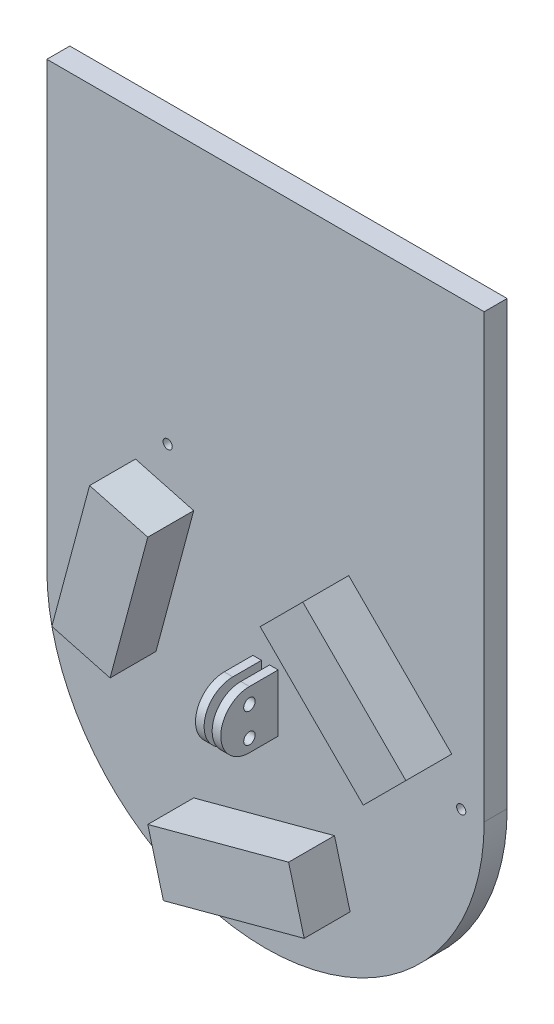
ISO-10303-21;
HEADER;
FILE_DESCRIPTION(('STEP AP214'),'2;1');
FILE_NAME('part.step','',(''),(''),'','','');
FILE_SCHEMA(('AUTOMOTIVE_DESIGN { 1 0 10303 214 1 1 1 1 }'));
ENDSEC;
DATA;
#1=APPLICATION_CONTEXT('core data for automotive mechanical design processes');
#2=APPLICATION_PROTOCOL_DEFINITION('international standard','automotive_design',2000,#1);
#3=PRODUCT_CONTEXT('',#1,'mechanical');
#4=PRODUCT('Part','Part','',(#3));
#5=PRODUCT_RELATED_PRODUCT_CATEGORY('part','',(#4));
#6=PRODUCT_DEFINITION_FORMATION('','',#4);
#7=PRODUCT_DEFINITION_CONTEXT('part definition',#1,'design');
#8=PRODUCT_DEFINITION('design','',#6,#7);
#9=PRODUCT_DEFINITION_SHAPE('','',#8);
#10=(LENGTH_UNIT() NAMED_UNIT(*) SI_UNIT(.MILLI.,.METRE.));
#11=(NAMED_UNIT(*) PLANE_ANGLE_UNIT() SI_UNIT($,.RADIAN.));
#12=(NAMED_UNIT(*) SI_UNIT($,.STERADIAN.) SOLID_ANGLE_UNIT());
#13=UNCERTAINTY_MEASURE_WITH_UNIT(LENGTH_MEASURE(1.E-05),#10,'distance_accuracy_value','');
#14=(GEOMETRIC_REPRESENTATION_CONTEXT(3) GLOBAL_UNCERTAINTY_ASSIGNED_CONTEXT((#13)) GLOBAL_UNIT_ASSIGNED_CONTEXT((#10,
#11,#12)) REPRESENTATION_CONTEXT('',''));
#15=CARTESIAN_POINT('',(0.,0.,0.));
#16=DIRECTION('',(0.,0.,1.));
#17=DIRECTION('',(1.,0.,0.));
#18=AXIS2_PLACEMENT_3D('',#15,#16,#17);
#19=CARTESIAN_POINT('',(0.,0.,4.));
#20=DIRECTION('',(0.,0.,1.));
#21=DIRECTION('',(1.,0.,0.));
#22=AXIS2_PLACEMENT_3D('',#19,#20,#21);
#23=PLANE('',#22);
#24=CARTESIAN_POINT('',(0.,0.,4.));
#25=DIRECTION('',(0.,0.,1.));
#26=DIRECTION('',(1.,0.,0.));
#27=AXIS2_PLACEMENT_3D('',#24,#25,#26);
#28=CIRCLE('',#27,0.6);
#29=CARTESIAN_POINT('',(0.6,0.,4.));
#30=VERTEX_POINT('',#29);
#31=EDGE_CURVE('E432',#30,#30,#28,.T.);
#32=ORIENTED_EDGE('',*,*,#31,.F.);
#33=EDGE_LOOP('',(#32));
#34=FACE_BOUND('',#33,.T.);
#35=CARTESIAN_POINT('',(34.1000000000013,-0.0857218150126376,4.));
#36=DIRECTION('',(0.,0.,1.));
#37=DIRECTION('',(1.,0.,0.));
#38=AXIS2_PLACEMENT_3D('',#35,#36,#37);
#39=CIRCLE('',#38,0.800000000000003);
#40=CARTESIAN_POINT('',(34.9000000000013,-0.0857218150126376,4.));
#41=VERTEX_POINT('',#40);
#42=EDGE_CURVE('E437',#41,#41,#39,.T.);
#43=ORIENTED_EDGE('',*,*,#42,.F.);
#44=EDGE_LOOP('',(#43));
#45=FACE_BOUND('',#44,.T.);
#46=CARTESIAN_POINT('',(-17.0499999999986,-29.617188084062,4.));
#47=DIRECTION('',(0.,0.,1.));
#48=DIRECTION('',(1.,0.,0.));
#49=AXIS2_PLACEMENT_3D('',#46,#47,#48);
#50=CIRCLE('',#49,0.799999999999999);
#51=CARTESIAN_POINT('',(-16.2499999999986,-29.617188084062,4.));
#52=VERTEX_POINT('',#51);
#53=EDGE_CURVE('E442',#52,#52,#50,.T.);
#54=ORIENTED_EDGE('',*,*,#53,.F.);
#55=EDGE_LOOP('',(#54));
#56=FACE_BOUND('',#55,.T.);
#57=CARTESIAN_POINT('',(-17.0499999999987,29.4457444540367,4.));
#58=DIRECTION('',(0.,0.,1.));
#59=DIRECTION('',(1.,0.,0.));
#60=AXIS2_PLACEMENT_3D('',#57,#58,#59);
#61=CIRCLE('',#60,0.799999999999999);
#62=CARTESIAN_POINT('',(-16.2499999999986,29.4457444540367,4.));
#63=VERTEX_POINT('',#62);
#64=EDGE_CURVE('E446',#63,#63,#61,.T.);
#65=ORIENTED_EDGE('',*,*,#64,.F.);
#66=EDGE_LOOP('',(#65));
#67=FACE_BOUND('',#66,.T.);
#68=CARTESIAN_POINT('',(0.,0.,4.));
#69=DIRECTION('',(0.,0.,1.));
#70=DIRECTION('',(1.,0.,0.));
#71=AXIS2_PLACEMENT_3D('',#68,#69,#70);
#72=CIRCLE('',#71,38.1);
#73=CARTESIAN_POINT('',(-38.1,0.,4.));
#74=VERTEX_POINT('',#73);
#75=CARTESIAN_POINT('',(38.1,0.,4.));
#76=VERTEX_POINT('',#75);
#77=EDGE_CURVE('E11',#74,#76,#72,.T.);
#78=ORIENTED_EDGE('',*,*,#77,.T.);
#79=DIRECTION('',(0.,-1.,0.));
#80=VECTOR('',#79,1.);
#81=CARTESIAN_POINT('',(38.1,0.,4.));
#82=LINE('',#81,#80);
#83=CARTESIAN_POINT('',(38.1,77.,4.));
#84=VERTEX_POINT('',#83);
#85=EDGE_CURVE('E450',#84,#76,#82,.T.);
#86=ORIENTED_EDGE('',*,*,#85,.F.);
#87=DIRECTION('',(1.,0.,0.));
#88=VECTOR('',#87,1.);
#89=CARTESIAN_POINT('',(38.1,77.,4.));
#90=LINE('',#89,#88);
#91=CARTESIAN_POINT('',(-38.1,77.,4.));
#92=VERTEX_POINT('',#91);
#93=EDGE_CURVE('E459',#92,#84,#90,.T.);
#94=ORIENTED_EDGE('',*,*,#93,.F.);
#95=DIRECTION('',(0.,1.,0.));
#96=VECTOR('',#95,1.);
#97=CARTESIAN_POINT('',(-38.1,0.,4.));
#98=LINE('',#97,#96);
#99=EDGE_CURVE('E454',#74,#92,#98,.T.);
#100=ORIENTED_EDGE('',*,*,#99,.F.);
#101=EDGE_LOOP('',(#78,#86,#94,#100));
#102=FACE_BOUND('',#101,.T.);
#103=DIRECTION('',(1.,0.,0.));
#104=VECTOR('',#103,1.);
#105=CARTESIAN_POINT('',(0.7,-5.,4.));
#106=LINE('',#105,#104);
#107=CARTESIAN_POINT('',(0.7,-5.,4.));
#108=VERTEX_POINT('',#107);
#109=CARTESIAN_POINT('',(2.2,-5.,4.));
#110=VERTEX_POINT('',#109);
#111=EDGE_CURVE('E408',#108,#110,#106,.T.);
#112=ORIENTED_EDGE('',*,*,#111,.F.);
#113=DIRECTION('',(0.,-1.,0.));
#114=VECTOR('',#113,1.);
#115=CARTESIAN_POINT('',(0.699999999999999,5.,4.));
#116=LINE('',#115,#114);
#117=CARTESIAN_POINT('',(0.699999999999999,5.,4.));
#118=VERTEX_POINT('',#117);
#119=EDGE_CURVE('E404',#118,#108,#116,.T.);
#120=ORIENTED_EDGE('',*,*,#119,.F.);
#121=DIRECTION('',(-1.,0.,0.));
#122=VECTOR('',#121,1.);
#123=CARTESIAN_POINT('',(0.699999999999999,5.,4.));
#124=LINE('',#123,#122);
#125=CARTESIAN_POINT('',(2.2,5.,4.));
#126=VERTEX_POINT('',#125);
#127=EDGE_CURVE('E416',#126,#118,#124,.T.);
#128=ORIENTED_EDGE('',*,*,#127,.F.);
#129=DIRECTION('',(0.,1.,0.));
#130=VECTOR('',#129,1.);
#131=CARTESIAN_POINT('',(2.2,5.,4.));
#132=LINE('',#131,#130);
#133=EDGE_CURVE('E412',#110,#126,#132,.T.);
#134=ORIENTED_EDGE('',*,*,#133,.F.);
#135=EDGE_LOOP('',(#112,#120,#128,#134));
#136=FACE_BOUND('',#135,.T.);
#137=DIRECTION('',(-1.,0.,0.));
#138=VECTOR('',#137,1.);
#139=CARTESIAN_POINT('',(-0.700000000000001,5.,4.));
#140=LINE('',#139,#138);
#141=CARTESIAN_POINT('',(-0.700000000000001,5.,4.));
#142=VERTEX_POINT('',#141);
#143=CARTESIAN_POINT('',(-2.2,5.,4.));
#144=VERTEX_POINT('',#143);
#145=EDGE_CURVE('E396',#142,#144,#140,.T.);
#146=ORIENTED_EDGE('',*,*,#145,.F.);
#147=DIRECTION('',(0.,1.,0.));
#148=VECTOR('',#147,1.);
#149=CARTESIAN_POINT('',(-0.700000000000001,5.,4.));
#150=LINE('',#149,#148);
#151=CARTESIAN_POINT('',(-0.7,-5.,4.));
#152=VERTEX_POINT('',#151);
#153=EDGE_CURVE('E400',#152,#142,#150,.T.);
#154=ORIENTED_EDGE('',*,*,#153,.F.);
#155=DIRECTION('',(1.,0.,0.));
#156=VECTOR('',#155,1.);
#157=CARTESIAN_POINT('',(-0.7,-5.,4.));
#158=LINE('',#157,#156);
#159=CARTESIAN_POINT('',(-2.2,-5.,4.));
#160=VERTEX_POINT('',#159);
#161=EDGE_CURVE('E388',#160,#152,#158,.T.);
#162=ORIENTED_EDGE('',*,*,#161,.F.);
#163=DIRECTION('',(0.,-1.,0.));
#164=VECTOR('',#163,1.);
#165=CARTESIAN_POINT('',(-2.2,5.,4.));
#166=LINE('',#165,#164);
#167=EDGE_CURVE('E392',#144,#160,#166,.T.);
#168=ORIENTED_EDGE('',*,*,#167,.F.);
#169=EDGE_LOOP('',(#146,#154,#162,#168));
#170=FACE_BOUND('',#169,.T.);
#171=DIRECTION('',(0.707106781186546,0.707106781186549,0.));
#172=VECTOR('',#171,1.);
#173=CARTESIAN_POINT('',(25.0287924547002,0.,4.));
#174=LINE('',#173,#172);
#175=CARTESIAN_POINT('',(25.0287924547002,0.,4.));
#176=VERTEX_POINT('',#175);
#177=CARTESIAN_POINT('',(32.4534136571589,7.42462120245876,4.));
#178=VERTEX_POINT('',#177);
#179=EDGE_CURVE('E305',#176,#178,#174,.T.);
#180=ORIENTED_EDGE('',*,*,#179,.F.);
#181=DIRECTION('',(0.707106781186549,-0.707106781186546,0.));
#182=VECTOR('',#181,1.);
#183=CARTESIAN_POINT('',(25.0287924547002,0.,4.));
#184=LINE('',#183,#182);
#185=CARTESIAN_POINT('',(7.06828021256182,17.9605122421383,4.));
#186=VERTEX_POINT('',#185);
#187=EDGE_CURVE('E275',#186,#176,#184,.T.);
#188=ORIENTED_EDGE('',*,*,#187,.F.);
#189=DIRECTION('',(-0.707106781186546,-0.707106781186549,0.));
#190=VECTOR('',#189,1.);
#191=CARTESIAN_POINT('',(7.06828021256182,17.9605122421383,4.));
#192=LINE('',#191,#190);
#193=CARTESIAN_POINT('',(14.4929014150206,25.385133444597,4.));
#194=VERTEX_POINT('',#193);
#195=EDGE_CURVE('E292',#194,#186,#192,.T.);
#196=ORIENTED_EDGE('',*,*,#195,.F.);
#197=DIRECTION('',(-0.707106781186549,0.707106781186546,0.));
#198=VECTOR('',#197,1.);
#199=CARTESIAN_POINT('',(32.4534136571589,7.42462120245876,4.));
#200=LINE('',#199,#198);
#201=EDGE_CURVE('E308',#178,#194,#200,.T.);
#202=ORIENTED_EDGE('',*,*,#201,.F.);
#203=EDGE_LOOP('',(#180,#188,#196,#202));
#204=FACE_BOUND('',#203,.T.);
#205=DIRECTION('',(0.258819045102518,-0.965925826289069,0.));
#206=VECTOR('',#205,1.);
#207=CARTESIAN_POINT('',(-12.5143962273502,-21.6755700918186,4.));
#208=LINE('',#207,#206);
#209=CARTESIAN_POINT('',(-12.5143962273502,-21.6755700918186,4.));
#210=VERTEX_POINT('',#209);
#211=CARTESIAN_POINT('',(-9.79679625377374,-31.8177912678538,4.));
#212=VERTEX_POINT('',#211);
#213=EDGE_CURVE('E268',#210,#212,#208,.T.);
#214=ORIENTED_EDGE('',*,*,#213,.F.);
#215=DIRECTION('',(-0.965925826289069,-0.258819045102518,0.));
#216=VECTOR('',#215,1.);
#217=CARTESIAN_POINT('',(-12.5143962273502,-21.6755700918186,4.));
#218=LINE('',#217,#216);
#219=CARTESIAN_POINT('',(12.0201197603922,-15.1015663462146,4.));
#220=VERTEX_POINT('',#219);
#221=EDGE_CURVE('E271',#220,#210,#218,.T.);
#222=ORIENTED_EDGE('',*,*,#221,.F.);
#223=DIRECTION('',(-0.258819045102518,0.965925826289069,0.));
#224=VECTOR('',#223,1.);
#225=CARTESIAN_POINT('',(12.0201197603922,-15.1015663462146,4.));
#226=LINE('',#225,#224);
#227=CARTESIAN_POINT('',(14.7377197339686,-25.2437875222498,4.));
#228=VERTEX_POINT('',#227);
#229=EDGE_CURVE('E261',#228,#220,#226,.T.);
#230=ORIENTED_EDGE('',*,*,#229,.F.);
#231=DIRECTION('',(0.965925826289069,0.258819045102518,0.));
#232=VECTOR('',#231,1.);
#233=CARTESIAN_POINT('',(-9.79679625377374,-31.8177912678538,4.));
#234=LINE('',#233,#232);
#235=EDGE_CURVE('E264',#212,#228,#234,.T.);
#236=ORIENTED_EDGE('',*,*,#235,.F.);
#237=EDGE_LOOP('',(#214,#222,#230,#236));
#238=FACE_BOUND('',#237,.T.);
#239=DIRECTION('',(-0.965925826289066,0.258819045102528,0.));
#240=VECTOR('',#239,1.);
#241=CARTESIAN_POINT('',(-12.5143962273499,21.6755700918187,4.));
#242=LINE('',#241,#240);
#243=CARTESIAN_POINT('',(-12.5143962273499,21.6755700918187,4.));
#244=VERTEX_POINT('',#243);
#245=CARTESIAN_POINT('',(-22.6566174033851,24.3931700653953,4.));
#246=VERTEX_POINT('',#245);
#247=EDGE_CURVE('E230',#244,#246,#242,.T.);
#248=ORIENTED_EDGE('',*,*,#247,.F.);
#249=DIRECTION('',(0.258819045102528,0.965925826289066,0.));
#250=VECTOR('',#249,1.);
#251=CARTESIAN_POINT('',(-12.5143962273499,21.6755700918187,4.));
#252=LINE('',#251,#250);
#253=CARTESIAN_POINT('',(-19.0883999729541,-2.85894589592355,4.));
#254=VERTEX_POINT('',#253);
#255=EDGE_CURVE('E224',#254,#244,#252,.T.);
#256=ORIENTED_EDGE('',*,*,#255,.F.);
#257=DIRECTION('',(0.965925826289066,-0.258819045102528,0.));
#258=VECTOR('',#257,1.);
#259=CARTESIAN_POINT('',(-19.0883999729541,-2.85894589592355,4.));
#260=LINE('',#259,#258);
#261=CARTESIAN_POINT('',(-29.2306211489893,-0.141345922347008,4.));
#262=VERTEX_POINT('',#261);
#263=EDGE_CURVE('E208',#262,#254,#260,.T.);
#264=ORIENTED_EDGE('',*,*,#263,.F.);
#265=DIRECTION('',(-0.258819045102528,-0.965925826289066,0.));
#266=VECTOR('',#265,1.);
#267=CARTESIAN_POINT('',(-22.6566174033851,24.3931700653953,4.));
#268=LINE('',#267,#266);
#269=EDGE_CURVE('E217',#246,#262,#268,.T.);
#270=ORIENTED_EDGE('',*,*,#269,.F.);
#271=EDGE_LOOP('',(#248,#256,#264,#270));
#272=FACE_BOUND('',#271,.T.);
#273=ADVANCED_FACE('F43',(#34,#45,#56,#67,#102,#136,#170,#204,#238,#272),#23,.T.);
#274=CARTESIAN_POINT('',(0.699999999999999,5.,14.));
#275=DIRECTION('',(1.,0.,0.));
#276=DIRECTION('',(0.,1.,0.));
#277=AXIS2_PLACEMENT_3D('',#274,#275,#276);
#278=PLANE('',#277);
#279=CARTESIAN_POINT('',(0.699999999999999,2.3,9.));
#280=DIRECTION('',(1.,0.,0.));
#281=DIRECTION('',(0.,1.,0.));
#282=AXIS2_PLACEMENT_3D('',#279,#280,#281);
#283=CIRCLE('',#282,1.);
#284=CARTESIAN_POINT('',(0.699999999999999,3.3,9.));
#285=VERTEX_POINT('',#284);
#286=EDGE_CURVE('E348',#285,#285,#283,.T.);
#287=ORIENTED_EDGE('',*,*,#286,.T.);
#288=EDGE_LOOP('',(#287));
#289=FACE_BOUND('',#288,.T.);
#290=CARTESIAN_POINT('',(0.699999999999999,-2.8,9.));
#291=DIRECTION('',(1.,0.,0.));
#292=DIRECTION('',(0.,1.,0.));
#293=AXIS2_PLACEMENT_3D('',#290,#291,#292);
#294=CIRCLE('',#293,1.);
#295=CARTESIAN_POINT('',(0.699999999999999,-1.8,9.));
#296=VERTEX_POINT('',#295);
#297=EDGE_CURVE('E340',#296,#296,#294,.T.);
#298=ORIENTED_EDGE('',*,*,#297,.T.);
#299=EDGE_LOOP('',(#298));
#300=FACE_BOUND('',#299,.T.);
#301=DIRECTION('',(0.,0.,-1.));
#302=VECTOR('',#301,1.);
#303=CARTESIAN_POINT('',(0.7,-5.,14.));
#304=LINE('',#303,#302);
#305=CARTESIAN_POINT('',(0.699999999999999,-5.,9.));
#306=VERTEX_POINT('',#305);
#307=EDGE_CURVE('E429',#306,#108,#304,.T.);
#308=ORIENTED_EDGE('',*,*,#307,.F.);
#309=CARTESIAN_POINT('',(0.699999999999999,0.,9.));
#310=DIRECTION('',(1.,0.,0.));
#311=DIRECTION('',(0.,1.,0.));
#312=AXIS2_PLACEMENT_3D('',#309,#310,#311);
#313=CIRCLE('',#312,5.);
#314=CARTESIAN_POINT('',(0.699999999999999,5.,9.));
#315=VERTEX_POINT('',#314);
#316=EDGE_CURVE('E372',#306,#315,#313,.F.);
#317=ORIENTED_EDGE('',*,*,#316,.T.);
#318=DIRECTION('',(0.,0.,-1.));
#319=VECTOR('',#318,1.);
#320=CARTESIAN_POINT('',(0.699999999999999,5.,14.));
#321=LINE('',#320,#319);
#322=EDGE_CURVE('E420',#315,#118,#321,.T.);
#323=ORIENTED_EDGE('',*,*,#322,.T.);
#324=ORIENTED_EDGE('',*,*,#119,.T.);
#325=EDGE_LOOP('',(#308,#317,#323,#324));
#326=FACE_BOUND('',#325,.T.);
#327=ADVANCED_FACE('F565',(#289,#300,#326),#278,.F.);
#328=CARTESIAN_POINT('',(2.2,5.,14.));
#329=DIRECTION('',(-1.,0.,0.));
#330=DIRECTION('',(0.,0.,1.));
#331=AXIS2_PLACEMENT_3D('',#328,#329,#330);
#332=PLANE('',#331);
#333=CARTESIAN_POINT('',(2.2,2.3,9.));
#334=DIRECTION('',(1.,0.,0.));
#335=DIRECTION('',(0.,1.,0.));
#336=AXIS2_PLACEMENT_3D('',#333,#334,#335);
#337=CIRCLE('',#336,1.);
#338=CARTESIAN_POINT('',(2.2,3.3,9.));
#339=VERTEX_POINT('',#338);
#340=EDGE_CURVE('E328',#339,#339,#337,.T.);
#341=ORIENTED_EDGE('',*,*,#340,.F.);
#342=EDGE_LOOP('',(#341));
#343=FACE_BOUND('',#342,.T.);
#344=CARTESIAN_POINT('',(2.2,-2.8,9.));
#345=DIRECTION('',(1.,0.,0.));
#346=DIRECTION('',(0.,1.,0.));
#347=AXIS2_PLACEMENT_3D('',#344,#345,#346);
#348=CIRCLE('',#347,1.);
#349=CARTESIAN_POINT('',(2.2,-1.8,9.));
#350=VERTEX_POINT('',#349);
#351=EDGE_CURVE('E327',#350,#350,#348,.T.);
#352=ORIENTED_EDGE('',*,*,#351,.F.);
#353=EDGE_LOOP('',(#352));
#354=FACE_BOUND('',#353,.T.);
#355=CARTESIAN_POINT('',(2.2,0.,9.));
#356=DIRECTION('',(1.,0.,0.));
#357=DIRECTION('',(0.,1.,0.));
#358=AXIS2_PLACEMENT_3D('',#355,#356,#357);
#359=CIRCLE('',#358,5.);
#360=CARTESIAN_POINT('',(2.2,-5.,9.));
#361=VERTEX_POINT('',#360);
#362=CARTESIAN_POINT('',(2.2,5.,9.));
#363=VERTEX_POINT('',#362);
#364=EDGE_CURVE('E357',#361,#363,#359,.F.);
#365=ORIENTED_EDGE('',*,*,#364,.F.);
#366=DIRECTION('',(0.,0.,-1.));
#367=VECTOR('',#366,1.);
#368=CARTESIAN_POINT('',(2.2,-5.,14.));
#369=LINE('',#368,#367);
#370=EDGE_CURVE('E426',#361,#110,#369,.T.);
#371=ORIENTED_EDGE('',*,*,#370,.T.);
#372=ORIENTED_EDGE('',*,*,#133,.T.);
#373=DIRECTION('',(0.,0.,-1.));
#374=VECTOR('',#373,1.);
#375=CARTESIAN_POINT('',(2.2,5.,14.));
#376=LINE('',#375,#374);
#377=EDGE_CURVE('E423',#363,#126,#376,.T.);
#378=ORIENTED_EDGE('',*,*,#377,.F.);
#379=EDGE_LOOP('',(#365,#371,#372,#378));
#380=FACE_BOUND('',#379,.T.);
#381=ADVANCED_FACE('F522',(#343,#354,#380),#332,.F.);
#382=CARTESIAN_POINT('',(-0.700000000000001,5.,14.));
#383=DIRECTION('',(-1.,0.,0.));
#384=DIRECTION('',(0.,-1.,0.));
#385=AXIS2_PLACEMENT_3D('',#382,#383,#384);
#386=PLANE('',#385);
#387=CARTESIAN_POINT('',(-0.699999999999999,2.3,9.));
#388=DIRECTION('',(-1.,0.,0.));
#389=DIRECTION('',(0.,-1.,0.));
#390=AXIS2_PLACEMENT_3D('',#387,#388,#389);
#391=CIRCLE('',#390,1.);
#392=CARTESIAN_POINT('',(-0.699999999999999,1.3,9.));
#393=VERTEX_POINT('',#392);
#394=EDGE_CURVE('E344',#393,#393,#391,.T.);
#395=ORIENTED_EDGE('',*,*,#394,.T.);
#396=EDGE_LOOP('',(#395));
#397=FACE_BOUND('',#396,.T.);
#398=CARTESIAN_POINT('',(-0.699999999999999,-2.8,9.));
#399=DIRECTION('',(-1.,0.,0.));
#400=DIRECTION('',(0.,-1.,0.));
#401=AXIS2_PLACEMENT_3D('',#398,#399,#400);
#402=CIRCLE('',#401,1.);
#403=CARTESIAN_POINT('',(-0.699999999999999,-3.8,9.));
#404=VERTEX_POINT('',#403);
#405=EDGE_CURVE('E336',#404,#404,#402,.T.);
#406=ORIENTED_EDGE('',*,*,#405,.T.);
#407=EDGE_LOOP('',(#406));
#408=FACE_BOUND('',#407,.T.);
#409=CARTESIAN_POINT('',(-0.699999999999999,0.,9.));
#410=DIRECTION('',(-1.,0.,0.));
#411=DIRECTION('',(0.,-1.,0.));
#412=AXIS2_PLACEMENT_3D('',#409,#410,#411);
#413=CIRCLE('',#412,5.);
#414=CARTESIAN_POINT('',(-0.699999999999999,5.,9.));
#415=VERTEX_POINT('',#414);
#416=CARTESIAN_POINT('',(-0.699999999999999,-5.,9.));
#417=VERTEX_POINT('',#416);
#418=EDGE_CURVE('E369',#415,#417,#413,.F.);
#419=ORIENTED_EDGE('',*,*,#418,.T.);
#420=DIRECTION('',(0.,0.,-1.));
#421=VECTOR('',#420,1.);
#422=CARTESIAN_POINT('',(-0.7,-5.,14.));
#423=LINE('',#422,#421);
#424=EDGE_CURVE('E385',#417,#152,#423,.T.);
#425=ORIENTED_EDGE('',*,*,#424,.T.);
#426=ORIENTED_EDGE('',*,*,#153,.T.);
#427=DIRECTION('',(0.,0.,-1.));
#428=VECTOR('',#427,1.);
#429=CARTESIAN_POINT('',(-0.700000000000001,5.,14.));
#430=LINE('',#429,#428);
#431=EDGE_CURVE('E376',#415,#142,#430,.T.);
#432=ORIENTED_EDGE('',*,*,#431,.F.);
#433=EDGE_LOOP('',(#419,#425,#426,#432));
#434=FACE_BOUND('',#433,.T.);
#435=ADVANCED_FACE('F519',(#397,#408,#434),#386,.F.);
#436=CARTESIAN_POINT('',(-2.2,5.,14.));
#437=DIRECTION('',(1.,0.,0.));
#438=DIRECTION('',(0.,1.,0.));
#439=AXIS2_PLACEMENT_3D('',#436,#437,#438);
#440=PLANE('',#439);
#441=CARTESIAN_POINT('',(-2.2,2.3,9.));
#442=DIRECTION('',(1.,0.,0.));
#443=DIRECTION('',(0.,1.,0.));
#444=AXIS2_PLACEMENT_3D('',#441,#442,#443);
#445=CIRCLE('',#444,1.);
#446=CARTESIAN_POINT('',(-2.2,3.3,9.));
#447=VERTEX_POINT('',#446);
#448=EDGE_CURVE('E47',#447,#447,#445,.T.);
#449=ORIENTED_EDGE('',*,*,#448,.T.);
#450=EDGE_LOOP('',(#449));
#451=FACE_BOUND('',#450,.T.);
#452=CARTESIAN_POINT('',(-2.2,-2.8,9.));
#453=DIRECTION('',(1.,0.,0.));
#454=DIRECTION('',(0.,1.,0.));
#455=AXIS2_PLACEMENT_3D('',#452,#453,#454);
#456=CIRCLE('',#455,1.);
#457=CARTESIAN_POINT('',(-2.2,-1.8,9.));
#458=VERTEX_POINT('',#457);
#459=EDGE_CURVE('E332',#458,#458,#456,.T.);
#460=ORIENTED_EDGE('',*,*,#459,.T.);
#461=EDGE_LOOP('',(#460));
#462=FACE_BOUND('',#461,.T.);
#463=DIRECTION('',(0.,0.,-1.));
#464=VECTOR('',#463,1.);
#465=CARTESIAN_POINT('',(-2.2,-5.,14.));
#466=LINE('',#465,#464);
#467=CARTESIAN_POINT('',(-2.2,-5.,9.));
#468=VERTEX_POINT('',#467);
#469=EDGE_CURVE('E382',#468,#160,#466,.T.);
#470=ORIENTED_EDGE('',*,*,#469,.F.);
#471=CARTESIAN_POINT('',(-2.2,0.,9.));
#472=DIRECTION('',(1.,0.,0.));
#473=DIRECTION('',(0.,1.,0.));
#474=AXIS2_PLACEMENT_3D('',#471,#472,#473);
#475=CIRCLE('',#474,5.);
#476=CARTESIAN_POINT('',(-2.2,5.,9.));
#477=VERTEX_POINT('',#476);
#478=EDGE_CURVE('E365',#468,#477,#475,.F.);
#479=ORIENTED_EDGE('',*,*,#478,.T.);
#480=DIRECTION('',(0.,0.,-1.));
#481=VECTOR('',#480,1.);
#482=CARTESIAN_POINT('',(-2.2,5.,14.));
#483=LINE('',#482,#481);
#484=EDGE_CURVE('E379',#477,#144,#483,.T.);
#485=ORIENTED_EDGE('',*,*,#484,.T.);
#486=ORIENTED_EDGE('',*,*,#167,.T.);
#487=EDGE_LOOP('',(#470,#479,#485,#486));
#488=FACE_BOUND('',#487,.T.);
#489=ADVANCED_FACE('F507',(#451,#462,#488),#440,.F.);
#490=CARTESIAN_POINT('',(0.699999999999999,5.,14.));
#491=DIRECTION('',(0.,-1.,0.));
#492=DIRECTION('',(0.,0.,-1.));
#493=AXIS2_PLACEMENT_3D('',#490,#491,#492);
#494=PLANE('',#493);
#495=DIRECTION('',(1.,0.,0.));
#496=VECTOR('',#495,1.);
#497=CARTESIAN_POINT('',(-38.1,4.99999999999999,9.));
#498=LINE('',#497,#496);
#499=EDGE_CURVE('E360',#315,#363,#498,.T.);
#500=ORIENTED_EDGE('',*,*,#499,.T.);
#501=ORIENTED_EDGE('',*,*,#377,.T.);
#502=ORIENTED_EDGE('',*,*,#127,.T.);
#503=ORIENTED_EDGE('',*,*,#322,.F.);
#504=EDGE_LOOP('',(#500,#501,#502,#503));
#505=FACE_BOUND('',#504,.T.);
#506=ADVANCED_FACE('F620',(#505),#494,.F.);
#507=CARTESIAN_POINT('',(-0.700000000000001,5.,14.));
#508=DIRECTION('',(0.,-1.,0.));
#509=DIRECTION('',(0.,0.,-1.));
#510=AXIS2_PLACEMENT_3D('',#507,#508,#509);
#511=PLANE('',#510);
#512=EDGE_CURVE('E364',#477,#415,#498,.T.);
#513=ORIENTED_EDGE('',*,*,#512,.T.);
#514=ORIENTED_EDGE('',*,*,#431,.T.);
#515=ORIENTED_EDGE('',*,*,#145,.T.);
#516=ORIENTED_EDGE('',*,*,#484,.F.);
#517=EDGE_LOOP('',(#513,#514,#515,#516));
#518=FACE_BOUND('',#517,.T.);
#519=ADVANCED_FACE('F544',(#518),#511,.F.);
#520=CARTESIAN_POINT('',(0.,0.,4.));
#521=DIRECTION('',(0.,0.,-1.));
#522=DIRECTION('',(-1.,0.,0.));
#523=AXIS2_PLACEMENT_3D('',#520,#521,#522);
#524=CYLINDRICAL_SURFACE('',#523,38.1);
#525=ORIENTED_EDGE('',*,*,#77,.F.);
#526=DIRECTION('',(0.,0.,-1.));
#527=VECTOR('',#526,1.);
#528=CARTESIAN_POINT('',(-38.1,0.,4.));
#529=LINE('',#528,#527);
#530=CARTESIAN_POINT('',(-38.1,0.,0.));
#531=VERTEX_POINT('',#530);
#532=EDGE_CURVE('E482',#74,#531,#529,.T.);
#533=ORIENTED_EDGE('',*,*,#532,.T.);
#534=CARTESIAN_POINT('',(0.,0.,0.));
#535=DIRECTION('',(0.,0.,1.));
#536=DIRECTION('',(1.,0.,0.));
#537=AXIS2_PLACEMENT_3D('',#534,#535,#536);
#538=CIRCLE('',#537,38.1);
#539=CARTESIAN_POINT('',(38.1,0.,0.));
#540=VERTEX_POINT('',#539);
#541=EDGE_CURVE('E53',#531,#540,#538,.T.);
#542=ORIENTED_EDGE('',*,*,#541,.T.);
#543=DIRECTION('',(0.,0.,-1.));
#544=VECTOR('',#543,1.);
#545=CARTESIAN_POINT('',(38.1,0.,4.));
#546=LINE('',#545,#544);
#547=EDGE_CURVE('E463',#76,#540,#546,.T.);
#548=ORIENTED_EDGE('',*,*,#547,.F.);
#549=EDGE_LOOP('',(#525,#533,#542,#548));
#550=FACE_BOUND('',#549,.T.);
#551=ADVANCED_FACE('F45',(#550),#524,.T.);
#552=CARTESIAN_POINT('',(0.,0.,0.));
#553=DIRECTION('',(0.,0.,1.));
#554=DIRECTION('',(1.,0.,0.));
#555=AXIS2_PLACEMENT_3D('',#552,#553,#554);
#556=PLANE('',#555);
#557=CARTESIAN_POINT('',(0.,0.,0.));
#558=DIRECTION('',(0.,0.,1.));
#559=DIRECTION('',(1.,0.,0.));
#560=AXIS2_PLACEMENT_3D('',#557,#558,#559);
#561=CIRCLE('',#560,0.6);
#562=CARTESIAN_POINT('',(0.6,0.,0.));
#563=VERTEX_POINT('',#562);
#564=EDGE_CURVE('E436',#563,#563,#561,.T.);
#565=ORIENTED_EDGE('',*,*,#564,.T.);
#566=EDGE_LOOP('',(#565));
#567=FACE_BOUND('',#566,.T.);
#568=CARTESIAN_POINT('',(34.1000000000013,-0.0857218150126376,0.));
#569=DIRECTION('',(0.,0.,1.));
#570=DIRECTION('',(1.,0.,0.));
#571=AXIS2_PLACEMENT_3D('',#568,#569,#570);
#572=CIRCLE('',#571,0.800000000000003);
#573=CARTESIAN_POINT('',(34.9000000000013,-0.0857218150126376,0.));
#574=VERTEX_POINT('',#573);
#575=EDGE_CURVE('E469',#574,#574,#572,.T.);
#576=ORIENTED_EDGE('',*,*,#575,.T.);
#577=EDGE_LOOP('',(#576));
#578=FACE_BOUND('',#577,.T.);
#579=CARTESIAN_POINT('',(-17.0499999999986,-29.617188084062,0.));
#580=DIRECTION('',(0.,0.,1.));
#581=DIRECTION('',(1.,0.,0.));
#582=AXIS2_PLACEMENT_3D('',#579,#580,#581);
#583=CIRCLE('',#582,0.799999999999999);
#584=CARTESIAN_POINT('',(-16.2499999999986,-29.617188084062,0.));
#585=VERTEX_POINT('',#584);
#586=EDGE_CURVE('E494',#585,#585,#583,.T.);
#587=ORIENTED_EDGE('',*,*,#586,.T.);
#588=EDGE_LOOP('',(#587));
#589=FACE_BOUND('',#588,.T.);
#590=CARTESIAN_POINT('',(-17.0499999999987,29.4457444540367,0.));
#591=DIRECTION('',(0.,0.,1.));
#592=DIRECTION('',(1.,0.,0.));
#593=AXIS2_PLACEMENT_3D('',#590,#591,#592);
#594=CIRCLE('',#593,0.799999999999999);
#595=CARTESIAN_POINT('',(-16.2499999999986,29.4457444540367,0.));
#596=VERTEX_POINT('',#595);
#597=EDGE_CURVE('E441',#596,#596,#594,.T.);
#598=ORIENTED_EDGE('',*,*,#597,.T.);
#599=EDGE_LOOP('',(#598));
#600=FACE_BOUND('',#599,.T.);
#601=ORIENTED_EDGE('',*,*,#541,.F.);
#602=DIRECTION('',(0.,1.,0.));
#603=VECTOR('',#602,1.);
#604=CARTESIAN_POINT('',(-38.1,0.,0.));
#605=LINE('',#604,#603);
#606=CARTESIAN_POINT('',(-38.1,77.,0.));
#607=VERTEX_POINT('',#606);
#608=EDGE_CURVE('E468',#531,#607,#605,.T.);
#609=ORIENTED_EDGE('',*,*,#608,.T.);
#610=DIRECTION('',(1.,0.,0.));
#611=VECTOR('',#610,1.);
#612=CARTESIAN_POINT('',(38.1,77.,0.));
#613=LINE('',#612,#611);
#614=CARTESIAN_POINT('',(38.1,77.,0.));
#615=VERTEX_POINT('',#614);
#616=EDGE_CURVE('E455',#607,#615,#613,.T.);
#617=ORIENTED_EDGE('',*,*,#616,.T.);
#618=DIRECTION('',(0.,-1.,0.));
#619=VECTOR('',#618,1.);
#620=CARTESIAN_POINT('',(38.1,0.,0.));
#621=LINE('',#620,#619);
#622=EDGE_CURVE('E464',#615,#540,#621,.T.);
#623=ORIENTED_EDGE('',*,*,#622,.T.);
#624=EDGE_LOOP('',(#601,#609,#617,#623));
#625=FACE_BOUND('',#624,.T.);
#626=ADVANCED_FACE('F578',(#567,#578,#589,#600,#625),#556,.F.);
#627=CARTESIAN_POINT('',(38.1,0.,4.));
#628=DIRECTION('',(1.,0.,0.));
#629=DIRECTION('',(0.,1.,0.));
#630=AXIS2_PLACEMENT_3D('',#627,#628,#629);
#631=PLANE('',#630);
#632=ORIENTED_EDGE('',*,*,#622,.F.);
#633=DIRECTION('',(0.,0.,-1.));
#634=VECTOR('',#633,1.);
#635=CARTESIAN_POINT('',(38.1,77.,4.));
#636=LINE('',#635,#634);
#637=EDGE_CURVE('E476',#84,#615,#636,.T.);
#638=ORIENTED_EDGE('',*,*,#637,.F.);
#639=ORIENTED_EDGE('',*,*,#85,.T.);
#640=ORIENTED_EDGE('',*,*,#547,.T.);
#641=EDGE_LOOP('',(#632,#638,#639,#640));
#642=FACE_BOUND('',#641,.T.);
#643=ADVANCED_FACE('F576',(#642),#631,.T.);
#644=CARTESIAN_POINT('',(38.1,77.,4.));
#645=DIRECTION('',(0.,1.,0.));
#646=DIRECTION('',(0.,0.,1.));
#647=AXIS2_PLACEMENT_3D('',#644,#645,#646);
#648=PLANE('',#647);
#649=ORIENTED_EDGE('',*,*,#616,.F.);
#650=DIRECTION('',(0.,0.,-1.));
#651=VECTOR('',#650,1.);
#652=CARTESIAN_POINT('',(-38.1,77.,4.));
#653=LINE('',#652,#651);
#654=EDGE_CURVE('E479',#92,#607,#653,.T.);
#655=ORIENTED_EDGE('',*,*,#654,.F.);
#656=ORIENTED_EDGE('',*,*,#93,.T.);
#657=ORIENTED_EDGE('',*,*,#637,.T.);
#658=EDGE_LOOP('',(#649,#655,#656,#657));
#659=FACE_BOUND('',#658,.T.);
#660=ADVANCED_FACE('F585',(#659),#648,.T.);
#661=CARTESIAN_POINT('',(-38.1,0.,4.));
#662=DIRECTION('',(-1.,0.,0.));
#663=DIRECTION('',(0.,-1.,0.));
#664=AXIS2_PLACEMENT_3D('',#661,#662,#663);
#665=PLANE('',#664);
#666=ORIENTED_EDGE('',*,*,#608,.F.);
#667=ORIENTED_EDGE('',*,*,#532,.F.);
#668=ORIENTED_EDGE('',*,*,#99,.T.);
#669=ORIENTED_EDGE('',*,*,#654,.T.);
#670=EDGE_LOOP('',(#666,#667,#668,#669));
#671=FACE_BOUND('',#670,.T.);
#672=ADVANCED_FACE('F602',(#671),#665,.T.);
#673=CARTESIAN_POINT('',(-17.0499999999987,29.4457444540367,-2.));
#674=DIRECTION('',(0.,0.,1.));
#675=DIRECTION('',(1.,0.,0.));
#676=AXIS2_PLACEMENT_3D('',#673,#674,#675);
#677=CYLINDRICAL_SURFACE('',#676,0.799999999999999);
#678=ORIENTED_EDGE('',*,*,#64,.T.);
#679=EDGE_LOOP('',(#678));
#680=FACE_BOUND('',#679,.T.);
#681=ORIENTED_EDGE('',*,*,#597,.F.);
#682=EDGE_LOOP('',(#681));
#683=FACE_BOUND('',#682,.T.);
#684=ADVANCED_FACE('F654',(#680,#683),#677,.F.);
#685=CARTESIAN_POINT('',(-17.0499999999986,-29.617188084062,-2.));
#686=DIRECTION('',(0.,0.,1.));
#687=DIRECTION('',(1.,0.,0.));
#688=AXIS2_PLACEMENT_3D('',#685,#686,#687);
#689=CYLINDRICAL_SURFACE('',#688,0.799999999999999);
#690=ORIENTED_EDGE('',*,*,#53,.T.);
#691=EDGE_LOOP('',(#690));
#692=FACE_BOUND('',#691,.T.);
#693=ORIENTED_EDGE('',*,*,#586,.F.);
#694=EDGE_LOOP('',(#693));
#695=FACE_BOUND('',#694,.T.);
#696=ADVANCED_FACE('F650',(#692,#695),#689,.F.);
#697=CARTESIAN_POINT('',(34.1000000000013,-0.0857218150126376,-2.));
#698=DIRECTION('',(0.,0.,1.));
#699=DIRECTION('',(1.,0.,0.));
#700=AXIS2_PLACEMENT_3D('',#697,#698,#699);
#701=CYLINDRICAL_SURFACE('',#700,0.800000000000003);
#702=ORIENTED_EDGE('',*,*,#42,.T.);
#703=EDGE_LOOP('',(#702));
#704=FACE_BOUND('',#703,.T.);
#705=ORIENTED_EDGE('',*,*,#575,.F.);
#706=EDGE_LOOP('',(#705));
#707=FACE_BOUND('',#706,.T.);
#708=ADVANCED_FACE('F646',(#704,#707),#701,.F.);
#709=CARTESIAN_POINT('',(0.,0.,-2.));
#710=DIRECTION('',(0.,0.,1.));
#711=DIRECTION('',(1.,0.,0.));
#712=AXIS2_PLACEMENT_3D('',#709,#710,#711);
#713=CYLINDRICAL_SURFACE('',#712,0.6);
#714=ORIENTED_EDGE('',*,*,#31,.T.);
#715=EDGE_LOOP('',(#714));
#716=FACE_BOUND('',#715,.T.);
#717=ORIENTED_EDGE('',*,*,#564,.F.);
#718=EDGE_LOOP('',(#717));
#719=FACE_BOUND('',#718,.T.);
#720=ADVANCED_FACE('F642',(#716,#719),#713,.F.);
#721=CARTESIAN_POINT('',(0.7,-5.,14.));
#722=DIRECTION('',(0.,1.,0.));
#723=DIRECTION('',(-1.,0.,0.));
#724=AXIS2_PLACEMENT_3D('',#721,#722,#723);
#725=PLANE('',#724);
#726=ORIENTED_EDGE('',*,*,#370,.F.);
#727=DIRECTION('',(1.,0.,0.));
#728=VECTOR('',#727,1.);
#729=CARTESIAN_POINT('',(-38.1,-5.00000000000001,9.));
#730=LINE('',#729,#728);
#731=EDGE_CURVE('E352',#306,#361,#730,.T.);
#732=ORIENTED_EDGE('',*,*,#731,.F.);
#733=ORIENTED_EDGE('',*,*,#307,.T.);
#734=ORIENTED_EDGE('',*,*,#111,.T.);
#735=EDGE_LOOP('',(#726,#732,#733,#734));
#736=FACE_BOUND('',#735,.T.);
#737=ADVANCED_FACE('F614',(#736),#725,.F.);
#738=CARTESIAN_POINT('',(-0.7,-5.,14.));
#739=DIRECTION('',(0.,1.,0.));
#740=DIRECTION('',(0.,0.,1.));
#741=AXIS2_PLACEMENT_3D('',#738,#739,#740);
#742=PLANE('',#741);
#743=ORIENTED_EDGE('',*,*,#424,.F.);
#744=EDGE_CURVE('E356',#468,#417,#730,.T.);
#745=ORIENTED_EDGE('',*,*,#744,.F.);
#746=ORIENTED_EDGE('',*,*,#469,.T.);
#747=ORIENTED_EDGE('',*,*,#161,.T.);
#748=EDGE_LOOP('',(#743,#745,#746,#747));
#749=FACE_BOUND('',#748,.T.);
#750=ADVANCED_FACE('F535',(#749),#742,.F.);
#751=CARTESIAN_POINT('',(-38.1,0.,9.));
#752=DIRECTION('',(1.,0.,0.));
#753=DIRECTION('',(0.,1.,0.));
#754=AXIS2_PLACEMENT_3D('',#751,#752,#753);
#755=CYLINDRICAL_SURFACE('',#754,5.);
#756=ORIENTED_EDGE('',*,*,#512,.F.);
#757=ORIENTED_EDGE('',*,*,#478,.F.);
#758=ORIENTED_EDGE('',*,*,#744,.T.);
#759=ORIENTED_EDGE('',*,*,#418,.F.);
#760=EDGE_LOOP('',(#756,#757,#758,#759));
#761=FACE_BOUND('',#760,.T.);
#762=ADVANCED_FACE('F531',(#761),#755,.T.);
#763=ORIENTED_EDGE('',*,*,#316,.F.);
#764=ORIENTED_EDGE('',*,*,#731,.T.);
#765=ORIENTED_EDGE('',*,*,#364,.T.);
#766=ORIENTED_EDGE('',*,*,#499,.F.);
#767=EDGE_LOOP('',(#763,#764,#765,#766));
#768=FACE_BOUND('',#767,.T.);
#769=ADVANCED_FACE('F514',(#768),#755,.T.);
#770=CARTESIAN_POINT('',(-38.1,-2.80000000000001,9.));
#771=DIRECTION('',(1.,0.,0.));
#772=DIRECTION('',(0.,1.,0.));
#773=AXIS2_PLACEMENT_3D('',#770,#771,#772);
#774=CYLINDRICAL_SURFACE('',#773,1.);
#775=ORIENTED_EDGE('',*,*,#459,.F.);
#776=EDGE_LOOP('',(#775));
#777=FACE_BOUND('',#776,.T.);
#778=ORIENTED_EDGE('',*,*,#405,.F.);
#779=EDGE_LOOP('',(#778));
#780=FACE_BOUND('',#779,.T.);
#781=ADVANCED_FACE('F510',(#777,#780),#774,.F.);
#782=CARTESIAN_POINT('',(-38.1,2.29999999999999,9.));
#783=DIRECTION('',(1.,0.,0.));
#784=DIRECTION('',(0.,1.,0.));
#785=AXIS2_PLACEMENT_3D('',#782,#783,#784);
#786=CYLINDRICAL_SURFACE('',#785,1.);
#787=ORIENTED_EDGE('',*,*,#448,.F.);
#788=EDGE_LOOP('',(#787));
#789=FACE_BOUND('',#788,.T.);
#790=ORIENTED_EDGE('',*,*,#394,.F.);
#791=EDGE_LOOP('',(#790));
#792=FACE_BOUND('',#791,.T.);
#793=ADVANCED_FACE('F513',(#789,#792),#786,.F.);
#794=ORIENTED_EDGE('',*,*,#351,.T.);
#795=EDGE_LOOP('',(#794));
#796=FACE_BOUND('',#795,.T.);
#797=ORIENTED_EDGE('',*,*,#297,.F.);
#798=EDGE_LOOP('',(#797));
#799=FACE_BOUND('',#798,.T.);
#800=ADVANCED_FACE('F516',(#796,#799),#774,.F.);
#801=ORIENTED_EDGE('',*,*,#340,.T.);
#802=EDGE_LOOP('',(#801));
#803=FACE_BOUND('',#802,.T.);
#804=ORIENTED_EDGE('',*,*,#286,.F.);
#805=EDGE_LOOP('',(#804));
#806=FACE_BOUND('',#805,.T.);
#807=ADVANCED_FACE('F554',(#803,#806),#786,.F.);
#808=CARTESIAN_POINT('',(25.0287924547002,0.,12.));
#809=DIRECTION('',(0.707106781186546,0.707106781186549,0.));
#810=DIRECTION('',(-0.707106781186549,0.707106781186546,0.));
#811=AXIS2_PLACEMENT_3D('',#808,#809,#810);
#812=PLANE('',#811);
#813=ORIENTED_EDGE('',*,*,#187,.T.);
#814=DIRECTION('',(0.,0.,-1.));
#815=VECTOR('',#814,1.);
#816=CARTESIAN_POINT('',(25.0287924547002,0.,12.));
#817=LINE('',#816,#815);
#818=CARTESIAN_POINT('',(25.0287924547002,0.,12.));
#819=VERTEX_POINT('',#818);
#820=EDGE_CURVE('E324',#819,#176,#817,.T.);
#821=ORIENTED_EDGE('',*,*,#820,.F.);
#822=DIRECTION('',(0.707106781186549,-0.707106781186546,0.));
#823=VECTOR('',#822,1.);
#824=CARTESIAN_POINT('',(25.0287924547002,0.,12.));
#825=LINE('',#824,#823);
#826=CARTESIAN_POINT('',(7.06828021256182,17.9605122421383,12.));
#827=VERTEX_POINT('',#826);
#828=EDGE_CURVE('E287',#827,#819,#825,.T.);
#829=ORIENTED_EDGE('',*,*,#828,.F.);
#830=DIRECTION('',(0.,0.,-1.));
#831=VECTOR('',#830,1.);
#832=CARTESIAN_POINT('',(7.06828021256182,17.9605122421383,12.));
#833=LINE('',#832,#831);
#834=EDGE_CURVE('E301',#827,#186,#833,.T.);
#835=ORIENTED_EDGE('',*,*,#834,.T.);
#836=EDGE_LOOP('',(#813,#821,#829,#835));
#837=FACE_BOUND('',#836,.T.);
#838=ADVANCED_FACE('F562',(#837),#812,.F.);
#839=CARTESIAN_POINT('',(25.0287924547002,0.,12.));
#840=DIRECTION('',(-0.707106781186549,0.707106781186546,0.));
#841=DIRECTION('',(-0.707106781186546,-0.707106781186549,0.));
#842=AXIS2_PLACEMENT_3D('',#839,#840,#841);
#843=PLANE('',#842);
#844=ORIENTED_EDGE('',*,*,#179,.T.);
#845=DIRECTION('',(0.,0.,-1.));
#846=VECTOR('',#845,1.);
#847=CARTESIAN_POINT('',(32.4534136571589,7.42462120245876,12.));
#848=LINE('',#847,#846);
#849=CARTESIAN_POINT('',(32.4534136571589,7.42462120245876,12.));
#850=VERTEX_POINT('',#849);
#851=EDGE_CURVE('E320',#850,#178,#848,.T.);
#852=ORIENTED_EDGE('',*,*,#851,.F.);
#853=DIRECTION('',(0.707106781186546,0.707106781186549,0.));
#854=VECTOR('',#853,1.);
#855=CARTESIAN_POINT('',(25.0287924547002,0.,12.));
#856=LINE('',#855,#854);
#857=EDGE_CURVE('E291',#819,#850,#856,.T.);
#858=ORIENTED_EDGE('',*,*,#857,.F.);
#859=ORIENTED_EDGE('',*,*,#820,.T.);
#860=EDGE_LOOP('',(#844,#852,#858,#859));
#861=FACE_BOUND('',#860,.T.);
#862=ADVANCED_FACE('F771',(#861),#843,.F.);
#863=CARTESIAN_POINT('',(32.4534136571589,7.42462120245876,12.));
#864=DIRECTION('',(-0.707106781186546,-0.707106781186549,0.));
#865=DIRECTION('',(0.707106781186549,-0.707106781186546,0.));
#866=AXIS2_PLACEMENT_3D('',#863,#864,#865);
#867=PLANE('',#866);
#868=ORIENTED_EDGE('',*,*,#201,.T.);
#869=DIRECTION('',(0.,0.,-1.));
#870=VECTOR('',#869,1.);
#871=CARTESIAN_POINT('',(14.4929014150206,25.385133444597,12.));
#872=LINE('',#871,#870);
#873=CARTESIAN_POINT('',(14.4929014150206,25.385133444597,12.));
#874=VERTEX_POINT('',#873);
#875=EDGE_CURVE('E317',#874,#194,#872,.T.);
#876=ORIENTED_EDGE('',*,*,#875,.F.);
#877=DIRECTION('',(-0.707106781186549,0.707106781186546,0.));
#878=VECTOR('',#877,1.);
#879=CARTESIAN_POINT('',(32.4534136571589,7.42462120245876,12.));
#880=LINE('',#879,#878);
#881=EDGE_CURVE('E295',#850,#874,#880,.T.);
#882=ORIENTED_EDGE('',*,*,#881,.F.);
#883=ORIENTED_EDGE('',*,*,#851,.T.);
#884=EDGE_LOOP('',(#868,#876,#882,#883));
#885=FACE_BOUND('',#884,.T.);
#886=ADVANCED_FACE('F780',(#885),#867,.F.);
#887=CARTESIAN_POINT('',(7.06828021256182,17.9605122421383,12.));
#888=DIRECTION('',(0.707106781186549,-0.707106781186546,0.));
#889=DIRECTION('',(0.707106781186546,0.707106781186549,0.));
#890=AXIS2_PLACEMENT_3D('',#887,#888,#889);
#891=PLANE('',#890);
#892=ORIENTED_EDGE('',*,*,#195,.T.);
#893=ORIENTED_EDGE('',*,*,#834,.F.);
#894=DIRECTION('',(-0.707106781186546,-0.707106781186549,0.));
#895=VECTOR('',#894,1.);
#896=CARTESIAN_POINT('',(7.06828021256182,17.9605122421383,12.));
#897=LINE('',#896,#895);
#898=EDGE_CURVE('E298',#874,#827,#897,.T.);
#899=ORIENTED_EDGE('',*,*,#898,.F.);
#900=ORIENTED_EDGE('',*,*,#875,.T.);
#901=EDGE_LOOP('',(#892,#893,#899,#900));
#902=FACE_BOUND('',#901,.T.);
#903=ADVANCED_FACE('F791',(#902),#891,.F.);
#904=CARTESIAN_POINT('',(0.,0.,12.));
#905=DIRECTION('',(0.,0.,-1.));
#906=DIRECTION('',(-1.,0.,0.));
#907=AXIS2_PLACEMENT_3D('',#904,#905,#906);
#908=PLANE('',#907);
#909=ORIENTED_EDGE('',*,*,#828,.T.);
#910=ORIENTED_EDGE('',*,*,#857,.T.);
#911=ORIENTED_EDGE('',*,*,#881,.T.);
#912=ORIENTED_EDGE('',*,*,#898,.T.);
#913=EDGE_LOOP('',(#909,#910,#911,#912));
#914=FACE_BOUND('',#913,.T.);
#915=ADVANCED_FACE('F802',(#914),#908,.F.);
#916=CARTESIAN_POINT('',(-12.5143962273502,-21.6755700918186,12.));
#917=DIRECTION('',(0.258819045102518,-0.965925826289069,0.));
#918=DIRECTION('',(0.965925826289069,0.258819045102518,0.));
#919=AXIS2_PLACEMENT_3D('',#916,#917,#918);
#920=PLANE('',#919);
#921=ORIENTED_EDGE('',*,*,#221,.T.);
#922=DIRECTION('',(0.,0.,-1.));
#923=VECTOR('',#922,1.);
#924=CARTESIAN_POINT('',(-12.5143962273502,-21.6755700918186,12.));
#925=LINE('',#924,#923);
#926=CARTESIAN_POINT('',(-12.5143962273502,-21.6755700918186,12.));
#927=VERTEX_POINT('',#926);
#928=EDGE_CURVE('E232',#927,#210,#925,.T.);
#929=ORIENTED_EDGE('',*,*,#928,.F.);
#930=DIRECTION('',(-0.965925826289069,-0.258819045102518,0.));
#931=VECTOR('',#930,1.);
#932=CARTESIAN_POINT('',(-12.5143962273502,-21.6755700918186,12.));
#933=LINE('',#932,#931);
#934=CARTESIAN_POINT('',(12.0201197603922,-15.1015663462146,12.));
#935=VERTEX_POINT('',#934);
#936=EDGE_CURVE('E265',#935,#927,#933,.T.);
#937=ORIENTED_EDGE('',*,*,#936,.F.);
#938=DIRECTION('',(0.,0.,-1.));
#939=VECTOR('',#938,1.);
#940=CARTESIAN_POINT('',(12.0201197603922,-15.1015663462146,12.));
#941=LINE('',#940,#939);
#942=EDGE_CURVE('E256',#935,#220,#941,.T.);
#943=ORIENTED_EDGE('',*,*,#942,.T.);
#944=EDGE_LOOP('',(#921,#929,#937,#943));
#945=FACE_BOUND('',#944,.T.);
#946=ADVANCED_FACE('F813',(#945),#920,.F.);
#947=CARTESIAN_POINT('',(-12.5143962273502,-21.6755700918186,12.));
#948=DIRECTION('',(0.965925826289069,0.258819045102518,0.));
#949=DIRECTION('',(-0.258819045102518,0.965925826289069,0.));
#950=AXIS2_PLACEMENT_3D('',#947,#948,#949);
#951=PLANE('',#950);
#952=ORIENTED_EDGE('',*,*,#213,.T.);
#953=DIRECTION('',(0.,0.,-1.));
#954=VECTOR('',#953,1.);
#955=CARTESIAN_POINT('',(-9.79679625377374,-31.8177912678538,12.));
#956=LINE('',#955,#954);
#957=CARTESIAN_POINT('',(-9.79679625377374,-31.8177912678538,12.));
#958=VERTEX_POINT('',#957);
#959=EDGE_CURVE('E236',#958,#212,#956,.T.);
#960=ORIENTED_EDGE('',*,*,#959,.F.);
#961=DIRECTION('',(0.258819045102518,-0.965925826289069,0.));
#962=VECTOR('',#961,1.);
#963=CARTESIAN_POINT('',(-12.5143962273502,-21.6755700918186,12.));
#964=LINE('',#963,#962);
#965=EDGE_CURVE('E281',#927,#958,#964,.T.);
#966=ORIENTED_EDGE('',*,*,#965,.F.);
#967=ORIENTED_EDGE('',*,*,#928,.T.);
#968=EDGE_LOOP('',(#952,#960,#966,#967));
#969=FACE_BOUND('',#968,.T.);
#970=ADVANCED_FACE('F824',(#969),#951,.F.);
#971=CARTESIAN_POINT('',(-9.79679625377374,-31.8177912678538,12.));
#972=DIRECTION('',(-0.258819045102518,0.965925826289069,0.));
#973=DIRECTION('',(-0.965925826289069,-0.258819045102518,0.));
#974=AXIS2_PLACEMENT_3D('',#971,#972,#973);
#975=PLANE('',#974);
#976=ORIENTED_EDGE('',*,*,#235,.T.);
#977=DIRECTION('',(0.,0.,-1.));
#978=VECTOR('',#977,1.);
#979=CARTESIAN_POINT('',(14.7377197339686,-25.2437875222498,12.));
#980=LINE('',#979,#978);
#981=CARTESIAN_POINT('',(14.7377197339686,-25.2437875222498,12.));
#982=VERTEX_POINT('',#981);
#983=EDGE_CURVE('E69',#982,#228,#980,.T.);
#984=ORIENTED_EDGE('',*,*,#983,.F.);
#985=DIRECTION('',(0.965925826289069,0.258819045102518,0.));
#986=VECTOR('',#985,1.);
#987=CARTESIAN_POINT('',(-9.79679625377374,-31.8177912678538,12.));
#988=LINE('',#987,#986);
#989=EDGE_CURVE('E278',#958,#982,#988,.T.);
#990=ORIENTED_EDGE('',*,*,#989,.F.);
#991=ORIENTED_EDGE('',*,*,#959,.T.);
#992=EDGE_LOOP('',(#976,#984,#990,#991));
#993=FACE_BOUND('',#992,.T.);
#994=ADVANCED_FACE('F835',(#993),#975,.F.);
#995=CARTESIAN_POINT('',(12.0201197603922,-15.1015663462146,12.));
#996=DIRECTION('',(-0.965925826289069,-0.258819045102518,0.));
#997=DIRECTION('',(0.258819045102518,-0.965925826289069,0.));
#998=AXIS2_PLACEMENT_3D('',#995,#996,#997);
#999=PLANE('',#998);
#1000=ORIENTED_EDGE('',*,*,#229,.T.);
#1001=ORIENTED_EDGE('',*,*,#942,.F.);
#1002=DIRECTION('',(-0.258819045102518,0.965925826289069,0.));
#1003=VECTOR('',#1002,1.);
#1004=CARTESIAN_POINT('',(12.0201197603922,-15.1015663462146,12.));
#1005=LINE('',#1004,#1003);
#1006=EDGE_CURVE('E260',#982,#935,#1005,.T.);
#1007=ORIENTED_EDGE('',*,*,#1006,.F.);
#1008=ORIENTED_EDGE('',*,*,#983,.T.);
#1009=EDGE_LOOP('',(#1000,#1001,#1007,#1008));
#1010=FACE_BOUND('',#1009,.T.);
#1011=ADVANCED_FACE('F846',(#1010),#999,.F.);
#1012=CARTESIAN_POINT('',(0.,0.,12.));
#1013=DIRECTION('',(0.,0.,-1.));
#1014=DIRECTION('',(-1.,0.,0.));
#1015=AXIS2_PLACEMENT_3D('',#1012,#1013,#1014);
#1016=PLANE('',#1015);
#1017=ORIENTED_EDGE('',*,*,#936,.T.);
#1018=ORIENTED_EDGE('',*,*,#965,.T.);
#1019=ORIENTED_EDGE('',*,*,#989,.T.);
#1020=ORIENTED_EDGE('',*,*,#1006,.T.);
#1021=EDGE_LOOP('',(#1017,#1018,#1019,#1020));
#1022=FACE_BOUND('',#1021,.T.);
#1023=ADVANCED_FACE('F857',(#1022),#1016,.F.);
#1024=CARTESIAN_POINT('',(-12.5143962273499,21.6755700918187,12.));
#1025=DIRECTION('',(-0.965925826289066,0.258819045102528,0.));
#1026=DIRECTION('',(-0.258819045102528,-0.965925826289066,0.));
#1027=AXIS2_PLACEMENT_3D('',#1024,#1025,#1026);
#1028=PLANE('',#1027);
#1029=ORIENTED_EDGE('',*,*,#255,.T.);
#1030=DIRECTION('',(0.,0.,-1.));
#1031=VECTOR('',#1030,1.);
#1032=CARTESIAN_POINT('',(-12.5143962273499,21.6755700918187,12.));
#1033=LINE('',#1032,#1031);
#1034=CARTESIAN_POINT('',(-12.5143962273499,21.6755700918187,12.));
#1035=VERTEX_POINT('',#1034);
#1036=EDGE_CURVE('E939',#1035,#244,#1033,.T.);
#1037=ORIENTED_EDGE('',*,*,#1036,.F.);
#1038=DIRECTION('',(0.258819045102528,0.965925826289066,0.));
#1039=VECTOR('',#1038,1.);
#1040=CARTESIAN_POINT('',(-12.5143962273499,21.6755700918187,12.));
#1041=LINE('',#1040,#1039);
#1042=CARTESIAN_POINT('',(-19.0883999729541,-2.85894589592355,12.));
#1043=VERTEX_POINT('',#1042);
#1044=EDGE_CURVE('E218',#1043,#1035,#1041,.T.);
#1045=ORIENTED_EDGE('',*,*,#1044,.F.);
#1046=DIRECTION('',(0.,0.,-1.));
#1047=VECTOR('',#1046,1.);
#1048=CARTESIAN_POINT('',(-19.0883999729541,-2.85894589592355,12.));
#1049=LINE('',#1048,#1047);
#1050=EDGE_CURVE('E211',#1043,#254,#1049,.T.);
#1051=ORIENTED_EDGE('',*,*,#1050,.T.);
#1052=EDGE_LOOP('',(#1029,#1037,#1045,#1051));
#1053=FACE_BOUND('',#1052,.T.);
#1054=ADVANCED_FACE('F222',(#1053),#1028,.F.);
#1055=CARTESIAN_POINT('',(-12.5143962273499,21.6755700918187,12.));
#1056=DIRECTION('',(-0.258819045102528,-0.965925826289066,0.));
#1057=DIRECTION('',(0.965925826289066,-0.258819045102528,0.));
#1058=AXIS2_PLACEMENT_3D('',#1055,#1056,#1057);
#1059=PLANE('',#1058);
#1060=ORIENTED_EDGE('',*,*,#247,.T.);
#1061=DIRECTION('',(0.,0.,-1.));
#1062=VECTOR('',#1061,1.);
#1063=CARTESIAN_POINT('',(-22.6566174033851,24.3931700653953,12.));
#1064=LINE('',#1063,#1062);
#1065=CARTESIAN_POINT('',(-22.6566174033851,24.3931700653953,12.));
#1066=VERTEX_POINT('',#1065);
#1067=EDGE_CURVE('E941',#1066,#246,#1064,.T.);
#1068=ORIENTED_EDGE('',*,*,#1067,.F.);
#1069=DIRECTION('',(-0.965925826289066,0.258819045102528,0.));
#1070=VECTOR('',#1069,1.);
#1071=CARTESIAN_POINT('',(-12.5143962273499,21.6755700918187,12.));
#1072=LINE('',#1071,#1070);
#1073=EDGE_CURVE('E246',#1035,#1066,#1072,.T.);
#1074=ORIENTED_EDGE('',*,*,#1073,.F.);
#1075=ORIENTED_EDGE('',*,*,#1036,.T.);
#1076=EDGE_LOOP('',(#1060,#1068,#1074,#1075));
#1077=FACE_BOUND('',#1076,.T.);
#1078=ADVANCED_FACE('F877',(#1077),#1059,.F.);
#1079=CARTESIAN_POINT('',(-22.6566174033851,24.3931700653953,12.));
#1080=DIRECTION('',(0.965925826289067,-0.258819045102528,0.));
#1081=DIRECTION('',(0.258819045102528,0.965925826289067,0.));
#1082=AXIS2_PLACEMENT_3D('',#1079,#1080,#1081);
#1083=PLANE('',#1082);
#1084=ORIENTED_EDGE('',*,*,#269,.T.);
#1085=DIRECTION('',(0.,0.,-1.));
#1086=VECTOR('',#1085,1.);
#1087=CARTESIAN_POINT('',(-29.2306211489893,-0.141345922347009,12.));
#1088=LINE('',#1087,#1086);
#1089=CARTESIAN_POINT('',(-29.2306211489893,-0.141345922347009,12.));
#1090=VERTEX_POINT('',#1089);
#1091=EDGE_CURVE('E61',#1090,#262,#1088,.T.);
#1092=ORIENTED_EDGE('',*,*,#1091,.F.);
#1093=DIRECTION('',(-0.258819045102528,-0.965925826289066,0.));
#1094=VECTOR('',#1093,1.);
#1095=CARTESIAN_POINT('',(-22.6566174033851,24.3931700653953,12.));
#1096=LINE('',#1095,#1094);
#1097=EDGE_CURVE('E243',#1066,#1090,#1096,.T.);
#1098=ORIENTED_EDGE('',*,*,#1097,.F.);
#1099=ORIENTED_EDGE('',*,*,#1067,.T.);
#1100=EDGE_LOOP('',(#1084,#1092,#1098,#1099));
#1101=FACE_BOUND('',#1100,.T.);
#1102=ADVANCED_FACE('F887',(#1101),#1083,.F.);
#1103=CARTESIAN_POINT('',(-19.0883999729541,-2.85894589592355,12.));
#1104=DIRECTION('',(0.258819045102528,0.965925826289067,0.));
#1105=DIRECTION('',(-0.965925826289066,0.258819045102528,0.));
#1106=AXIS2_PLACEMENT_3D('',#1103,#1104,#1105);
#1107=PLANE('',#1106);
#1108=ORIENTED_EDGE('',*,*,#263,.T.);
#1109=ORIENTED_EDGE('',*,*,#1050,.F.);
#1110=DIRECTION('',(0.965925826289066,-0.258819045102528,0.));
#1111=VECTOR('',#1110,1.);
#1112=CARTESIAN_POINT('',(-19.0883999729541,-2.85894589592355,12.));
#1113=LINE('',#1112,#1111);
#1114=EDGE_CURVE('E228',#1090,#1043,#1113,.T.);
#1115=ORIENTED_EDGE('',*,*,#1114,.F.);
#1116=ORIENTED_EDGE('',*,*,#1091,.T.);
#1117=EDGE_LOOP('',(#1108,#1109,#1115,#1116));
#1118=FACE_BOUND('',#1117,.T.);
#1119=ADVANCED_FACE('F210',(#1118),#1107,.F.);
#1120=CARTESIAN_POINT('',(0.,0.,12.));
#1121=DIRECTION('',(0.,0.,-1.));
#1122=DIRECTION('',(-1.,0.,0.));
#1123=AXIS2_PLACEMENT_3D('',#1120,#1121,#1122);
#1124=PLANE('',#1123);
#1125=ORIENTED_EDGE('',*,*,#1044,.T.);
#1126=ORIENTED_EDGE('',*,*,#1073,.T.);
#1127=ORIENTED_EDGE('',*,*,#1097,.T.);
#1128=ORIENTED_EDGE('',*,*,#1114,.T.);
#1129=EDGE_LOOP('',(#1125,#1126,#1127,#1128));
#1130=FACE_BOUND('',#1129,.T.);
#1131=ADVANCED_FACE('F908',(#1130),#1124,.F.);
#1132=CLOSED_SHELL('',(#273,#327,#381,#435,#489,#506,#519,#551,#626,#643,#660,#672,#684,#696,
#708,#720,#737,#750,#762,#769,#781,#793,#800,#807,#838,#862,#886,#903,#915,#946,#970,#994,#1011,
#1023,#1054,#1078,#1102,#1119,#1131));
#1133=MANIFOLD_SOLID_BREP('B2',#1132);
#1134=ADVANCED_BREP_SHAPE_REPRESENTATION('',(#18,#1133),#14);
#1135=SHAPE_DEFINITION_REPRESENTATION(#9,#1134);
ENDSEC;
END-ISO-10303-21;
